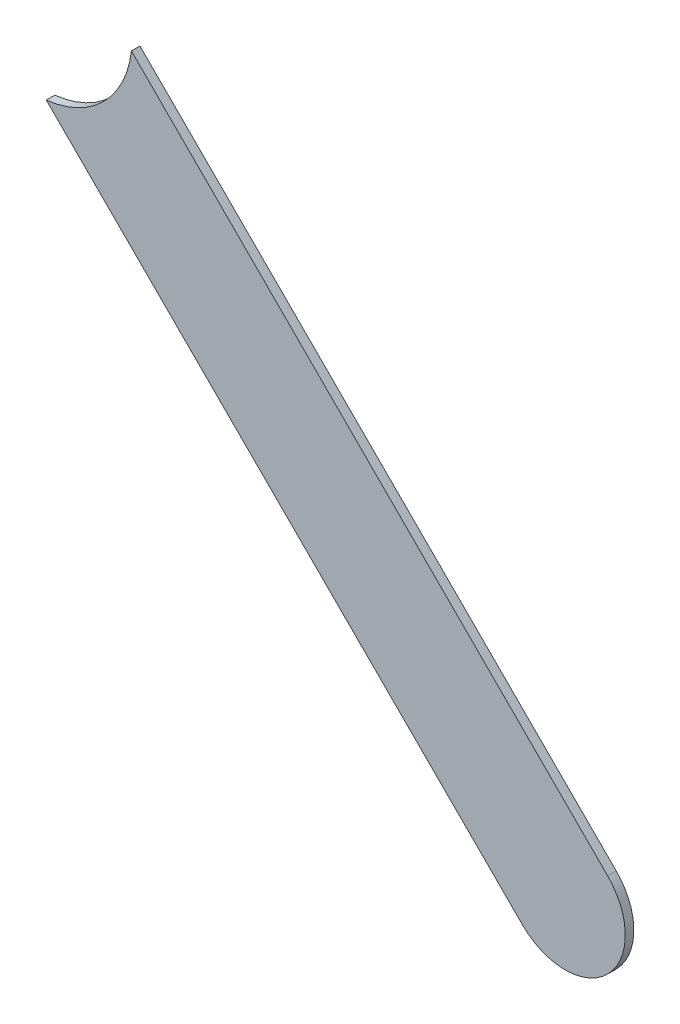
ISO-10303-21;
HEADER;
FILE_DESCRIPTION(('STEP AP214'),'2;1');
FILE_NAME('part.step','',(''),(''),'','','');
FILE_SCHEMA(('AUTOMOTIVE_DESIGN { 1 0 10303 214 1 1 1 1 }'));
ENDSEC;
DATA;
#1=APPLICATION_CONTEXT('core data for automotive mechanical design processes');
#2=APPLICATION_PROTOCOL_DEFINITION('international standard','automotive_design',2000,#1);
#3=PRODUCT_CONTEXT('',#1,'mechanical');
#4=PRODUCT('Part','Part','',(#3));
#5=PRODUCT_RELATED_PRODUCT_CATEGORY('part','',(#4));
#6=PRODUCT_DEFINITION_FORMATION('','',#4);
#7=PRODUCT_DEFINITION_CONTEXT('part definition',#1,'design');
#8=PRODUCT_DEFINITION('design','',#6,#7);
#9=PRODUCT_DEFINITION_SHAPE('','',#8);
#10=(LENGTH_UNIT() NAMED_UNIT(*) SI_UNIT(.MILLI.,.METRE.));
#11=(NAMED_UNIT(*) PLANE_ANGLE_UNIT() SI_UNIT($,.RADIAN.));
#12=(NAMED_UNIT(*) SI_UNIT($,.STERADIAN.) SOLID_ANGLE_UNIT());
#13=UNCERTAINTY_MEASURE_WITH_UNIT(LENGTH_MEASURE(1.E-05),#10,'distance_accuracy_value','');
#14=(GEOMETRIC_REPRESENTATION_CONTEXT(3) GLOBAL_UNCERTAINTY_ASSIGNED_CONTEXT((#13)) GLOBAL_UNIT_ASSIGNED_CONTEXT((#10,
#11,#12)) REPRESENTATION_CONTEXT('',''));
#15=CARTESIAN_POINT('',(0.,0.,0.));
#16=DIRECTION('',(0.,0.,1.));
#17=DIRECTION('',(1.,0.,0.));
#18=AXIS2_PLACEMENT_3D('',#15,#16,#17);
#19=CARTESIAN_POINT('',(60.0040191694402,74.9024572705598,0.));
#20=DIRECTION('',(0.707106781186548,0.707106781186548,0.));
#21=DIRECTION('',(0.707106781186548,-0.707106781186548,0.));
#22=AXIS2_PLACEMENT_3D('',#19,#20,#21);
#23=PLANE('',#22);
#24=DIRECTION('',(0.707106781186548,-0.707106781186548,0.));
#25=VECTOR('',#24,1.);
#26=CARTESIAN_POINT('',(59.78322562,75.12325082,0.03556));
#27=LINE('',#26,#25);
#28=CARTESIAN_POINT('',(60.0040191694402,74.9024572705598,0.03556));
#29=VERTEX_POINT('',#28);
#30=CARTESIAN_POINT('',(61.98205282,72.92442362,0.03556));
#31=VERTEX_POINT('',#30);
#32=EDGE_CURVE('E11',#29,#31,#27,.T.);
#33=ORIENTED_EDGE('',*,*,#32,.F.);
#34=DIRECTION('',(0.,0.,1.));
#35=VECTOR('',#34,1.);
#36=CARTESIAN_POINT('',(60.0040191694402,74.9024572705598,0.));
#37=LINE('',#36,#35);
#38=CARTESIAN_POINT('',(60.0040191694402,74.9024572705598,0.));
#39=VERTEX_POINT('',#38);
#40=EDGE_CURVE('E24',#39,#29,#37,.T.);
#41=ORIENTED_EDGE('',*,*,#40,.F.);
#42=DIRECTION('',(0.707106781186548,-0.707106781186548,0.));
#43=VECTOR('',#42,1.);
#44=CARTESIAN_POINT('',(59.78322562,75.12325082,0.));
#45=LINE('',#44,#43);
#46=CARTESIAN_POINT('',(61.98205282,72.92442362,0.));
#47=VERTEX_POINT('',#46);
#48=EDGE_CURVE('E75',#39,#47,#45,.T.);
#49=ORIENTED_EDGE('',*,*,#48,.T.);
#50=DIRECTION('',(0.,0.,1.));
#51=VECTOR('',#50,1.);
#52=CARTESIAN_POINT('',(61.98205282,72.92442362,0.));
#53=LINE('',#52,#51);
#54=EDGE_CURVE('E37',#47,#31,#53,.T.);
#55=ORIENTED_EDGE('',*,*,#54,.T.);
#56=EDGE_LOOP('',(#33,#41,#49,#55));
#57=FACE_BOUND('',#56,.T.);
#58=ADVANCED_FACE('F17',(#57),#23,.F.);
#59=CARTESIAN_POINT('',(62.1588292,73.1012,0.));
#60=DIRECTION('',(0.,0.,-1.));
#61=DIRECTION('',(-0.707106781186548,-0.707106781186548,0.));
#62=AXIS2_PLACEMENT_3D('',#59,#60,#61);
#63=CYLINDRICAL_SURFACE('',#62,0.249999554103223);
#64=CARTESIAN_POINT('',(62.1588292,73.1012,0.03556));
#65=DIRECTION('',(0.,0.,1.));
#66=DIRECTION('',(-0.707106781186548,-0.707106781186548,0.));
#67=AXIS2_PLACEMENT_3D('',#64,#65,#66);
#68=CIRCLE('',#67,0.249999554103223);
#69=CARTESIAN_POINT('',(62.33560558,73.27797638,0.03556));
#70=VERTEX_POINT('',#69);
#71=EDGE_CURVE('E83',#31,#70,#68,.T.);
#72=ORIENTED_EDGE('',*,*,#71,.F.);
#73=ORIENTED_EDGE('',*,*,#54,.F.);
#74=CARTESIAN_POINT('',(62.1588292,73.1012,0.));
#75=DIRECTION('',(0.,0.,1.));
#76=DIRECTION('',(-0.707106781186548,-0.707106781186548,0.));
#77=AXIS2_PLACEMENT_3D('',#74,#75,#76);
#78=CIRCLE('',#77,0.249999554103223);
#79=CARTESIAN_POINT('',(62.33560558,73.27797638,0.));
#80=VERTEX_POINT('',#79);
#81=EDGE_CURVE('E81',#47,#80,#78,.T.);
#82=ORIENTED_EDGE('',*,*,#81,.T.);
#83=DIRECTION('',(0.,0.,1.));
#84=VECTOR('',#83,1.);
#85=CARTESIAN_POINT('',(62.33560558,73.27797638,0.));
#86=LINE('',#85,#84);
#87=EDGE_CURVE('E67',#80,#70,#86,.T.);
#88=ORIENTED_EDGE('',*,*,#87,.T.);
#89=EDGE_LOOP('',(#72,#73,#82,#88));
#90=FACE_BOUND('',#89,.T.);
#91=ADVANCED_FACE('F89',(#90),#63,.T.);
#92=CARTESIAN_POINT('',(62.33560558,73.27797638,0.));
#93=DIRECTION('',(-0.707106781186546,-0.707106781186549,0.));
#94=DIRECTION('',(-0.707106781186549,0.707106781186546,0.));
#95=AXIS2_PLACEMENT_3D('',#92,#93,#94);
#96=PLANE('',#95);
#97=DIRECTION('',(-0.707106781186549,0.707106781186546,0.));
#98=VECTOR('',#97,1.);
#99=CARTESIAN_POINT('',(62.33560558,73.27797638,0.03556));
#100=LINE('',#99,#98);
#101=CARTESIAN_POINT('',(60.3575719294402,75.2560100305598,0.03556));
#102=VERTEX_POINT('',#101);
#103=EDGE_CURVE('E71',#70,#102,#100,.T.);
#104=ORIENTED_EDGE('',*,*,#103,.F.);
#105=ORIENTED_EDGE('',*,*,#87,.F.);
#106=DIRECTION('',(-0.707106781186549,0.707106781186546,0.));
#107=VECTOR('',#106,1.);
#108=CARTESIAN_POINT('',(62.33560558,73.27797638,0.));
#109=LINE('',#108,#107);
#110=CARTESIAN_POINT('',(60.3575719294402,75.2560100305598,0.));
#111=VERTEX_POINT('',#110);
#112=EDGE_CURVE('E63',#80,#111,#109,.T.);
#113=ORIENTED_EDGE('',*,*,#112,.T.);
#114=DIRECTION('',(0.,0.,1.));
#115=VECTOR('',#114,1.);
#116=CARTESIAN_POINT('',(60.3575719294402,75.2560100305598,0.));
#117=LINE('',#116,#115);
#118=EDGE_CURVE('E53',#111,#102,#117,.T.);
#119=ORIENTED_EDGE('',*,*,#118,.T.);
#120=EDGE_LOOP('',(#104,#105,#113,#119));
#121=FACE_BOUND('',#120,.T.);
#122=ADVANCED_FACE('F66',(#121),#96,.F.);
#123=CARTESIAN_POINT('',(59.960002,75.3000272,0.));
#124=DIRECTION('',(0.,0.,-1.));
#125=DIRECTION('',(1.,0.,0.));
#126=AXIS2_PLACEMENT_3D('',#123,#124,#125);
#127=CYLINDRICAL_SURFACE('',#126,0.3999992);
#128=ORIENTED_EDGE('',*,*,#40,.T.);
#129=CARTESIAN_POINT('',(59.960002,75.3000272,0.03556));
#130=DIRECTION('',(0.,0.,1.));
#131=DIRECTION('',(1.,0.,0.));
#132=AXIS2_PLACEMENT_3D('',#129,#130,#131);
#133=CIRCLE('',#132,0.3999992);
#134=EDGE_CURVE('E59',#29,#102,#133,.T.);
#135=ORIENTED_EDGE('',*,*,#134,.T.);
#136=ORIENTED_EDGE('',*,*,#118,.F.);
#137=CARTESIAN_POINT('',(59.960002,75.3000272,0.));
#138=DIRECTION('',(0.,0.,1.));
#139=DIRECTION('',(1.,0.,0.));
#140=AXIS2_PLACEMENT_3D('',#137,#138,#139);
#141=CIRCLE('',#140,0.3999992);
#142=EDGE_CURVE('E57',#39,#111,#141,.T.);
#143=ORIENTED_EDGE('',*,*,#142,.F.);
#144=EDGE_LOOP('',(#128,#135,#136,#143));
#145=FACE_BOUND('',#144,.T.);
#146=ADVANCED_FACE('F55',(#145),#127,.F.);
#147=CARTESIAN_POINT('',(59.78322562,75.12325082,0.));
#148=DIRECTION('',(0.,0.,-1.));
#149=DIRECTION('',(-1.,0.,0.));
#150=AXIS2_PLACEMENT_3D('',#147,#148,#149);
#151=PLANE('',#150);
#152=ORIENTED_EDGE('',*,*,#48,.F.);
#153=ORIENTED_EDGE('',*,*,#142,.T.);
#154=ORIENTED_EDGE('',*,*,#112,.F.);
#155=ORIENTED_EDGE('',*,*,#81,.F.);
#156=EDGE_LOOP('',(#152,#153,#154,#155));
#157=FACE_BOUND('',#156,.T.);
#158=ADVANCED_FACE('F74',(#157),#151,.T.);
#159=CARTESIAN_POINT('',(59.78322562,75.12325082,0.03556));
#160=DIRECTION('',(0.,0.,-1.));
#161=DIRECTION('',(-1.,0.,0.));
#162=AXIS2_PLACEMENT_3D('',#159,#160,#161);
#163=PLANE('',#162);
#164=ORIENTED_EDGE('',*,*,#134,.F.);
#165=ORIENTED_EDGE('',*,*,#32,.T.);
#166=ORIENTED_EDGE('',*,*,#71,.T.);
#167=ORIENTED_EDGE('',*,*,#103,.T.);
#168=EDGE_LOOP('',(#164,#165,#166,#167));
#169=FACE_BOUND('',#168,.T.);
#170=ADVANCED_FACE('F91',(#169),#163,.F.);
#171=CLOSED_SHELL('',(#58,#91,#122,#146,#158,#170));
#172=MANIFOLD_SOLID_BREP('B1',#171);
#173=ADVANCED_BREP_SHAPE_REPRESENTATION('',(#18,#172),#14);
#174=SHAPE_DEFINITION_REPRESENTATION(#9,#173);
ENDSEC;
END-ISO-10303-21;
